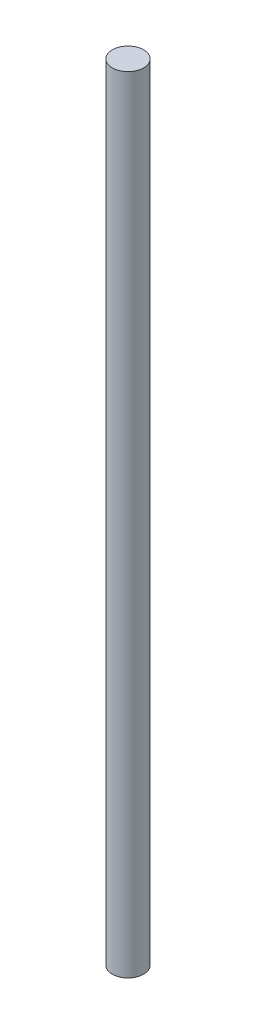
ISO-10303-21;
HEADER;
FILE_DESCRIPTION(('STEP AP214'),'2;1');
FILE_NAME('part.step','',(''),(''),'','','');
FILE_SCHEMA(('AUTOMOTIVE_DESIGN { 1 0 10303 214 1 1 1 1 }'));
ENDSEC;
DATA;
#1=APPLICATION_CONTEXT('core data for automotive mechanical design processes');
#2=APPLICATION_PROTOCOL_DEFINITION('international standard','automotive_design',2000,#1);
#3=PRODUCT_CONTEXT('',#1,'mechanical');
#4=PRODUCT('Part','Part','',(#3));
#5=PRODUCT_RELATED_PRODUCT_CATEGORY('part','',(#4));
#6=PRODUCT_DEFINITION_FORMATION('','',#4);
#7=PRODUCT_DEFINITION_CONTEXT('part definition',#1,'design');
#8=PRODUCT_DEFINITION('design','',#6,#7);
#9=PRODUCT_DEFINITION_SHAPE('','',#8);
#10=(LENGTH_UNIT() NAMED_UNIT(*) SI_UNIT(.MILLI.,.METRE.));
#11=(NAMED_UNIT(*) PLANE_ANGLE_UNIT() SI_UNIT($,.RADIAN.));
#12=(NAMED_UNIT(*) SI_UNIT($,.STERADIAN.) SOLID_ANGLE_UNIT());
#13=UNCERTAINTY_MEASURE_WITH_UNIT(LENGTH_MEASURE(1.E-05),#10,'distance_accuracy_value','');
#14=(GEOMETRIC_REPRESENTATION_CONTEXT(3) GLOBAL_UNCERTAINTY_ASSIGNED_CONTEXT((#13)) GLOBAL_UNIT_ASSIGNED_CONTEXT((#10,
#11,#12)) REPRESENTATION_CONTEXT('',''));
#15=CARTESIAN_POINT('',(0.,0.,0.));
#16=DIRECTION('',(0.,0.,1.));
#17=DIRECTION('',(1.,0.,0.));
#18=AXIS2_PLACEMENT_3D('',#15,#16,#17);
#19=CARTESIAN_POINT('',(0.,125.,0.));
#20=DIRECTION('',(0.,-1.,0.));
#21=DIRECTION('',(0.,0.,-1.));
#22=AXIS2_PLACEMENT_3D('',#19,#20,#21);
#23=CYLINDRICAL_SURFACE('',#22,2.5);
#24=CARTESIAN_POINT('',(0.,125.,0.));
#25=DIRECTION('',(0.,1.,0.));
#26=DIRECTION('',(0.,0.,1.));
#27=AXIS2_PLACEMENT_3D('',#24,#25,#26);
#28=CIRCLE('',#27,2.5);
#29=CARTESIAN_POINT('',(0.,125.,2.5));
#30=VERTEX_POINT('',#29);
#31=EDGE_CURVE('E10',#30,#30,#28,.T.);
#32=ORIENTED_EDGE('',*,*,#31,.F.);
#33=EDGE_LOOP('',(#32));
#34=FACE_BOUND('',#33,.T.);
#35=CARTESIAN_POINT('',(0.,0.,0.));
#36=DIRECTION('',(0.,1.,0.));
#37=DIRECTION('',(0.,0.,1.));
#38=AXIS2_PLACEMENT_3D('',#35,#36,#37);
#39=CIRCLE('',#38,2.5);
#40=CARTESIAN_POINT('',(0.,0.,2.5));
#41=VERTEX_POINT('',#40);
#42=EDGE_CURVE('E46',#41,#41,#39,.T.);
#43=ORIENTED_EDGE('',*,*,#42,.T.);
#44=EDGE_LOOP('',(#43));
#45=FACE_BOUND('',#44,.T.);
#46=ADVANCED_FACE('F43',(#34,#45),#23,.T.);
#47=CARTESIAN_POINT('',(0.,125.,0.));
#48=DIRECTION('',(0.,1.,0.));
#49=DIRECTION('',(0.,0.,1.));
#50=AXIS2_PLACEMENT_3D('',#47,#48,#49);
#51=PLANE('',#50);
#52=ORIENTED_EDGE('',*,*,#31,.T.);
#53=EDGE_LOOP('',(#52));
#54=FACE_BOUND('',#53,.T.);
#55=ADVANCED_FACE('F60',(#54),#51,.T.);
#56=CARTESIAN_POINT('',(0.,0.,0.));
#57=DIRECTION('',(0.,1.,0.));
#58=DIRECTION('',(0.,0.,1.));
#59=AXIS2_PLACEMENT_3D('',#56,#57,#58);
#60=PLANE('',#59);
#61=ORIENTED_EDGE('',*,*,#42,.F.);
#62=EDGE_LOOP('',(#61));
#63=FACE_BOUND('',#62,.T.);
#64=ADVANCED_FACE('F58',(#63),#60,.F.);
#65=CLOSED_SHELL('',(#46,#55,#64));
#66=MANIFOLD_SOLID_BREP('B2',#65);
#67=ADVANCED_BREP_SHAPE_REPRESENTATION('',(#18,#66),#14);
#68=SHAPE_DEFINITION_REPRESENTATION(#9,#67);
ENDSEC;
END-ISO-10303-21;
